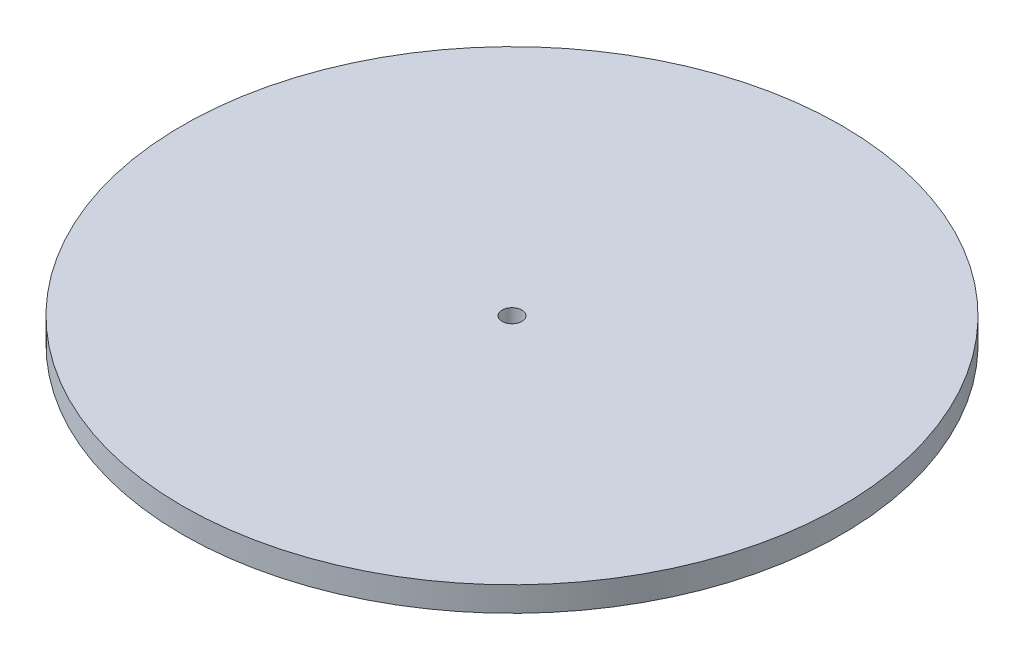
ISO-10303-21;
HEADER;
FILE_DESCRIPTION(('STEP AP214'),'2;1');
FILE_NAME('part.step','',(''),(''),'','','');
FILE_SCHEMA(('AUTOMOTIVE_DESIGN { 1 0 10303 214 1 1 1 1 }'));
ENDSEC;
DATA;
#1=APPLICATION_CONTEXT('core data for automotive mechanical design processes');
#2=APPLICATION_PROTOCOL_DEFINITION('international standard','automotive_design',2000,#1);
#3=PRODUCT_CONTEXT('',#1,'mechanical');
#4=PRODUCT('Part','Part','',(#3));
#5=PRODUCT_RELATED_PRODUCT_CATEGORY('part','',(#4));
#6=PRODUCT_DEFINITION_FORMATION('','',#4);
#7=PRODUCT_DEFINITION_CONTEXT('part definition',#1,'design');
#8=PRODUCT_DEFINITION('design','',#6,#7);
#9=PRODUCT_DEFINITION_SHAPE('','',#8);
#10=(LENGTH_UNIT() NAMED_UNIT(*) SI_UNIT(.MILLI.,.METRE.));
#11=(NAMED_UNIT(*) PLANE_ANGLE_UNIT() SI_UNIT($,.RADIAN.));
#12=(NAMED_UNIT(*) SI_UNIT($,.STERADIAN.) SOLID_ANGLE_UNIT());
#13=UNCERTAINTY_MEASURE_WITH_UNIT(LENGTH_MEASURE(1.E-05),#10,'distance_accuracy_value','');
#14=(GEOMETRIC_REPRESENTATION_CONTEXT(3) GLOBAL_UNCERTAINTY_ASSIGNED_CONTEXT((#13)) GLOBAL_UNIT_ASSIGNED_CONTEXT((#10,
#11,#12)) REPRESENTATION_CONTEXT('',''));
#15=CARTESIAN_POINT('',(0.,0.,0.));
#16=DIRECTION('',(0.,0.,1.));
#17=DIRECTION('',(1.,0.,0.));
#18=AXIS2_PLACEMENT_3D('',#15,#16,#17);
#19=CARTESIAN_POINT('',(0.,12.5099565370274,0.));
#20=DIRECTION('',(0.,1.,0.));
#21=DIRECTION('',(0.,0.,1.));
#22=AXIS2_PLACEMENT_3D('',#19,#20,#21);
#23=CYLINDRICAL_SURFACE('',#22,40.);
#24=CARTESIAN_POINT('',(0.,12.5099565370274,0.));
#25=DIRECTION('',(0.,1.,0.));
#26=DIRECTION('',(0.,0.,1.));
#27=AXIS2_PLACEMENT_3D('',#24,#25,#26);
#28=CIRCLE('',#27,40.);
#29=CARTESIAN_POINT('',(0.,12.5099565370274,40.));
#30=VERTEX_POINT('',#29);
#31=EDGE_CURVE('E50',#30,#30,#28,.T.);
#32=ORIENTED_EDGE('',*,*,#31,.F.);
#33=EDGE_LOOP('',(#32));
#34=FACE_BOUND('',#33,.T.);
#35=CARTESIAN_POINT('',(0.,9.50995653702743,0.));
#36=DIRECTION('',(0.,1.,0.));
#37=DIRECTION('',(0.,0.,1.));
#38=AXIS2_PLACEMENT_3D('',#35,#36,#37);
#39=CIRCLE('',#38,40.);
#40=CARTESIAN_POINT('',(0.,9.50995653702743,40.));
#41=VERTEX_POINT('',#40);
#42=EDGE_CURVE('E10',#41,#41,#39,.T.);
#43=ORIENTED_EDGE('',*,*,#42,.T.);
#44=EDGE_LOOP('',(#43));
#45=FACE_BOUND('',#44,.T.);
#46=ADVANCED_FACE('F31',(#34,#45),#23,.T.);
#47=CARTESIAN_POINT('',(37.,9.50995653702743,0.));
#48=DIRECTION('',(0.,1.,0.));
#49=DIRECTION('',(0.,0.,1.));
#50=AXIS2_PLACEMENT_3D('',#47,#48,#49);
#51=PLANE('',#50);
#52=ORIENTED_EDGE('',*,*,#42,.F.);
#53=EDGE_LOOP('',(#52));
#54=FACE_BOUND('',#53,.T.);
#55=CARTESIAN_POINT('',(0.,9.50995653702743,0.));
#56=DIRECTION('',(0.,1.,0.));
#57=DIRECTION('',(0.,0.,1.));
#58=AXIS2_PLACEMENT_3D('',#55,#56,#57);
#59=CIRCLE('',#58,37.);
#60=CARTESIAN_POINT('',(0.,9.50995653702743,37.));
#61=VERTEX_POINT('',#60);
#62=EDGE_CURVE('E37',#61,#61,#59,.T.);
#63=ORIENTED_EDGE('',*,*,#62,.T.);
#64=EDGE_LOOP('',(#63));
#65=FACE_BOUND('',#64,.T.);
#66=ADVANCED_FACE('F71',(#54,#65),#51,.F.);
#67=CARTESIAN_POINT('',(0.,12.5099565370274,0.));
#68=DIRECTION('',(0.,1.,0.));
#69=DIRECTION('',(0.,0.,1.));
#70=AXIS2_PLACEMENT_3D('',#67,#68,#69);
#71=CYLINDRICAL_SURFACE('',#70,37.);
#72=ORIENTED_EDGE('',*,*,#62,.F.);
#73=EDGE_LOOP('',(#72));
#74=FACE_BOUND('',#73,.T.);
#75=CARTESIAN_POINT('',(0.,8.50995653702743,0.));
#76=DIRECTION('',(0.,1.,0.));
#77=DIRECTION('',(0.,0.,1.));
#78=AXIS2_PLACEMENT_3D('',#75,#76,#77);
#79=CIRCLE('',#78,37.);
#80=CARTESIAN_POINT('',(0.,8.50995653702743,37.));
#81=VERTEX_POINT('',#80);
#82=EDGE_CURVE('E41',#81,#81,#79,.T.);
#83=ORIENTED_EDGE('',*,*,#82,.T.);
#84=EDGE_LOOP('',(#83));
#85=FACE_BOUND('',#84,.T.);
#86=ADVANCED_FACE('F67',(#74,#85),#71,.T.);
#87=CARTESIAN_POINT('',(1.23972338471334E-10,0.,0.));
#88=CARTESIAN_POINT('',(4.6250000042607,0.00115104957019512,0.));
#89=CARTESIAN_POINT('',(9.25000000642228,0.507761818481145,0.));
#90=CARTESIAN_POINT('',(13.875000006446,1.56146058608151,0.));
#91=CARTESIAN_POINT('',(18.500000005698,2.81268095358899,0.));
#92=CARTESIAN_POINT('',(23.1250000045052,4.17770382291348,0.));
#93=CARTESIAN_POINT('',(27.750000003059,5.60757027477678,0.));
#94=CARTESIAN_POINT('',(32.3750000015404,7.05598493191602,0.));
#95=CARTESIAN_POINT('',(37.,8.50995653702743,0.));
#96=B_SPLINE_CURVE_WITH_KNOTS('',8,(#87,#88,#89,#90,#91,#92,#93,#94,#95),.UNSPECIFIED.,.F.,.F.,
(9,9),(0.0834624923113512,0.918087416088293),.UNSPECIFIED.);
#97=CARTESIAN_POINT('',(0.,12.5099565370274,0.));
#98=DIRECTION('',(0.,1.,0.));
#99=AXIS1_PLACEMENT('',#97,#98);
#100=SURFACE_OF_REVOLUTION('',#96,#99);
#101=CARTESIAN_POINT('',(0.,0.0152360497280325,0.));
#102=DIRECTION('',(0.,1.,0.));
#103=DIRECTION('',(0.,0.,1.));
#104=AXIS2_PLACEMENT_3D('',#101,#102,#103);
#105=CIRCLE('',#104,1.2);
#106=CARTESIAN_POINT('',(0.,0.0152360497280325,1.2));
#107=VERTEX_POINT('',#106);
#108=EDGE_CURVE('E53',#107,#107,#105,.T.);
#109=ORIENTED_EDGE('',*,*,#108,.T.);
#110=EDGE_LOOP('',(#109));
#111=FACE_BOUND('',#110,.T.);
#112=ORIENTED_EDGE('',*,*,#82,.F.);
#113=EDGE_LOOP('',(#112));
#114=FACE_BOUND('',#113,.T.);
#115=ADVANCED_FACE('F62',(#111,#114),#100,.T.);
#116=CARTESIAN_POINT('',(0.,12.5099565370274,0.));
#117=DIRECTION('',(0.,1.,0.));
#118=DIRECTION('',(0.,0.,1.));
#119=AXIS2_PLACEMENT_3D('',#116,#117,#118);
#120=CYLINDRICAL_SURFACE('',#119,1.2);
#121=CARTESIAN_POINT('',(0.,12.5099565370274,0.));
#122=DIRECTION('',(0.,1.,0.));
#123=DIRECTION('',(0.,0.,1.));
#124=AXIS2_PLACEMENT_3D('',#121,#122,#123);
#125=CIRCLE('',#124,1.2);
#126=CARTESIAN_POINT('',(0.,12.5099565370274,1.2));
#127=VERTEX_POINT('',#126);
#128=EDGE_CURVE('E45',#127,#127,#125,.T.);
#129=ORIENTED_EDGE('',*,*,#128,.T.);
#130=EDGE_LOOP('',(#129));
#131=FACE_BOUND('',#130,.T.);
#132=ORIENTED_EDGE('',*,*,#108,.F.);
#133=EDGE_LOOP('',(#132));
#134=FACE_BOUND('',#133,.T.);
#135=ADVANCED_FACE('F66',(#131,#134),#120,.F.);
#136=CARTESIAN_POINT('',(40.,12.5099565370274,0.));
#137=DIRECTION('',(0.,-1.,0.));
#138=DIRECTION('',(0.,0.,-1.));
#139=AXIS2_PLACEMENT_3D('',#136,#137,#138);
#140=PLANE('',#139);
#141=ORIENTED_EDGE('',*,*,#128,.F.);
#142=EDGE_LOOP('',(#141));
#143=FACE_BOUND('',#142,.T.);
#144=ORIENTED_EDGE('',*,*,#31,.T.);
#145=EDGE_LOOP('',(#144));
#146=FACE_BOUND('',#145,.T.);
#147=ADVANCED_FACE('F83',(#143,#146),#140,.F.);
#148=CLOSED_SHELL('',(#46,#66,#86,#115,#135,#147));
#149=MANIFOLD_SOLID_BREP('B2',#148);
#150=ADVANCED_BREP_SHAPE_REPRESENTATION('',(#18,#149),#14);
#151=SHAPE_DEFINITION_REPRESENTATION(#9,#150);
ENDSEC;
END-ISO-10303-21;
